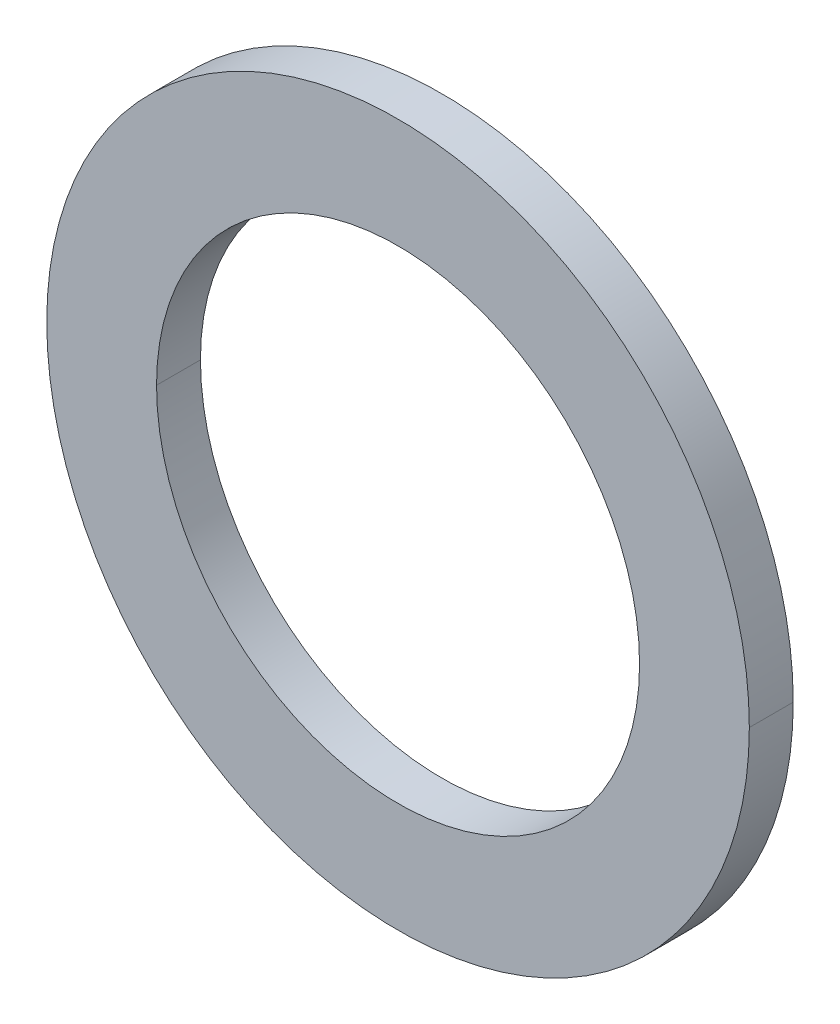
ISO-10303-21;
HEADER;
FILE_DESCRIPTION(('STEP AP214'),'2;1');
FILE_NAME('part.step','',(''),(''),'','','');
FILE_SCHEMA(('AUTOMOTIVE_DESIGN { 1 0 10303 214 1 1 1 1 }'));
ENDSEC;
DATA;
#1=APPLICATION_CONTEXT('core data for automotive mechanical design processes');
#2=APPLICATION_PROTOCOL_DEFINITION('international standard','automotive_design',2000,#1);
#3=PRODUCT_CONTEXT('',#1,'mechanical');
#4=PRODUCT('Part','Part','',(#3));
#5=PRODUCT_RELATED_PRODUCT_CATEGORY('part','',(#4));
#6=PRODUCT_DEFINITION_FORMATION('','',#4);
#7=PRODUCT_DEFINITION_CONTEXT('part definition',#1,'design');
#8=PRODUCT_DEFINITION('design','',#6,#7);
#9=PRODUCT_DEFINITION_SHAPE('','',#8);
#10=(LENGTH_UNIT() NAMED_UNIT(*) SI_UNIT(.MILLI.,.METRE.));
#11=(NAMED_UNIT(*) PLANE_ANGLE_UNIT() SI_UNIT($,.RADIAN.));
#12=(NAMED_UNIT(*) SI_UNIT($,.STERADIAN.) SOLID_ANGLE_UNIT());
#13=UNCERTAINTY_MEASURE_WITH_UNIT(LENGTH_MEASURE(1.E-05),#10,'distance_accuracy_value','');
#14=(GEOMETRIC_REPRESENTATION_CONTEXT(3) GLOBAL_UNCERTAINTY_ASSIGNED_CONTEXT((#13)) GLOBAL_UNIT_ASSIGNED_CONTEXT((#10,
#11,#12)) REPRESENTATION_CONTEXT('',''));
#15=CARTESIAN_POINT('',(0.,0.,0.));
#16=DIRECTION('',(0.,0.,1.));
#17=DIRECTION('',(1.,0.,0.));
#18=AXIS2_PLACEMENT_3D('',#15,#16,#17);
#19=CARTESIAN_POINT('',(0.,0.,1.));
#20=DIRECTION('',(0.,0.,-1.));
#21=DIRECTION('',(-1.,0.,0.));
#22=AXIS2_PLACEMENT_3D('',#19,#20,#21);
#23=CYLINDRICAL_SURFACE('',#22,5.5);
#24=CARTESIAN_POINT('',(0.,0.,1.));
#25=DIRECTION('',(0.,0.,1.));
#26=DIRECTION('',(1.,0.,0.));
#27=AXIS2_PLACEMENT_3D('',#24,#25,#26);
#28=CIRCLE('',#27,5.5);
#29=CARTESIAN_POINT('',(-5.5,0.,1.));
#30=VERTEX_POINT('',#29);
#31=CARTESIAN_POINT('',(5.5,0.,1.));
#32=VERTEX_POINT('',#31);
#33=EDGE_CURVE('E11',#30,#32,#28,.T.);
#34=ORIENTED_EDGE('',*,*,#33,.T.);
#35=DIRECTION('',(0.,0.,-1.));
#36=VECTOR('',#35,1.);
#37=CARTESIAN_POINT('',(5.5,0.,1.));
#38=LINE('',#37,#36);
#39=CARTESIAN_POINT('',(5.5,0.,0.));
#40=VERTEX_POINT('',#39);
#41=EDGE_CURVE('E28',#32,#40,#38,.T.);
#42=ORIENTED_EDGE('',*,*,#41,.T.);
#43=CARTESIAN_POINT('',(0.,0.,0.));
#44=DIRECTION('',(0.,0.,1.));
#45=DIRECTION('',(1.,0.,0.));
#46=AXIS2_PLACEMENT_3D('',#43,#44,#45);
#47=CIRCLE('',#46,5.5);
#48=CARTESIAN_POINT('',(-5.5,0.,0.));
#49=VERTEX_POINT('',#48);
#50=EDGE_CURVE('E82',#49,#40,#47,.T.);
#51=ORIENTED_EDGE('',*,*,#50,.F.);
#52=DIRECTION('',(0.,0.,-1.));
#53=VECTOR('',#52,1.);
#54=CARTESIAN_POINT('',(-5.5,0.,1.));
#55=LINE('',#54,#53);
#56=EDGE_CURVE('E107',#30,#49,#55,.T.);
#57=ORIENTED_EDGE('',*,*,#56,.F.);
#58=EDGE_LOOP('',(#34,#42,#51,#57));
#59=FACE_BOUND('',#58,.T.);
#60=ADVANCED_FACE('F17',(#59),#23,.F.);
#61=CARTESIAN_POINT('',(0.,0.,1.));
#62=DIRECTION('',(0.,0.,-1.));
#63=DIRECTION('',(-1.,0.,0.));
#64=AXIS2_PLACEMENT_3D('',#61,#62,#63);
#65=CYLINDRICAL_SURFACE('',#64,8.);
#66=CARTESIAN_POINT('',(0.,0.,1.));
#67=DIRECTION('',(0.,0.,1.));
#68=DIRECTION('',(1.,0.,0.));
#69=AXIS2_PLACEMENT_3D('',#66,#67,#68);
#70=CIRCLE('',#69,8.);
#71=CARTESIAN_POINT('',(8.,0.,1.));
#72=VERTEX_POINT('',#71);
#73=CARTESIAN_POINT('',(-8.,0.,1.));
#74=VERTEX_POINT('',#73);
#75=EDGE_CURVE('E70',#72,#74,#70,.T.);
#76=ORIENTED_EDGE('',*,*,#75,.F.);
#77=DIRECTION('',(0.,0.,-1.));
#78=VECTOR('',#77,1.);
#79=CARTESIAN_POINT('',(8.,0.,1.));
#80=LINE('',#79,#78);
#81=CARTESIAN_POINT('',(8.,0.,0.));
#82=VERTEX_POINT('',#81);
#83=EDGE_CURVE('E74',#72,#82,#80,.T.);
#84=ORIENTED_EDGE('',*,*,#83,.T.);
#85=CARTESIAN_POINT('',(0.,0.,0.));
#86=DIRECTION('',(0.,0.,1.));
#87=DIRECTION('',(1.,0.,0.));
#88=AXIS2_PLACEMENT_3D('',#85,#86,#87);
#89=CIRCLE('',#88,8.);
#90=CARTESIAN_POINT('',(-8.,0.,0.));
#91=VERTEX_POINT('',#90);
#92=EDGE_CURVE('E89',#82,#91,#89,.T.);
#93=ORIENTED_EDGE('',*,*,#92,.T.);
#94=DIRECTION('',(0.,0.,-1.));
#95=VECTOR('',#94,1.);
#96=CARTESIAN_POINT('',(-8.,0.,1.));
#97=LINE('',#96,#95);
#98=EDGE_CURVE('E21',#74,#91,#97,.T.);
#99=ORIENTED_EDGE('',*,*,#98,.F.);
#100=EDGE_LOOP('',(#76,#84,#93,#99));
#101=FACE_BOUND('',#100,.T.);
#102=ADVANCED_FACE('F72',(#101),#65,.T.);
#103=CARTESIAN_POINT('',(0.,0.,1.));
#104=DIRECTION('',(0.,0.,1.));
#105=DIRECTION('',(1.,0.,0.));
#106=AXIS2_PLACEMENT_3D('',#103,#104,#105);
#107=PLANE('',#106);
#108=CARTESIAN_POINT('',(0.,0.,1.));
#109=DIRECTION('',(0.,0.,1.));
#110=DIRECTION('',(1.,0.,0.));
#111=AXIS2_PLACEMENT_3D('',#108,#109,#110);
#112=CIRCLE('',#111,8.);
#113=EDGE_CURVE('E81',#74,#72,#112,.T.);
#114=ORIENTED_EDGE('',*,*,#113,.T.);
#115=ORIENTED_EDGE('',*,*,#75,.T.);
#116=EDGE_LOOP('',(#114,#115));
#117=FACE_BOUND('',#116,.T.);
#118=ORIENTED_EDGE('',*,*,#33,.F.);
#119=CARTESIAN_POINT('',(0.,0.,1.));
#120=DIRECTION('',(0.,0.,1.));
#121=DIRECTION('',(1.,0.,0.));
#122=AXIS2_PLACEMENT_3D('',#119,#120,#121);
#123=CIRCLE('',#122,5.5);
#124=EDGE_CURVE('E104',#32,#30,#123,.T.);
#125=ORIENTED_EDGE('',*,*,#124,.F.);
#126=EDGE_LOOP('',(#118,#125));
#127=FACE_BOUND('',#126,.T.);
#128=ADVANCED_FACE('F91',(#117,#127),#107,.T.);
#129=CARTESIAN_POINT('',(0.,0.,0.));
#130=DIRECTION('',(0.,0.,1.));
#131=DIRECTION('',(1.,0.,0.));
#132=AXIS2_PLACEMENT_3D('',#129,#130,#131);
#133=PLANE('',#132);
#134=CARTESIAN_POINT('',(0.,0.,0.));
#135=DIRECTION('',(0.,0.,1.));
#136=DIRECTION('',(1.,0.,0.));
#137=AXIS2_PLACEMENT_3D('',#134,#135,#136);
#138=CIRCLE('',#137,8.);
#139=EDGE_CURVE('E87',#91,#82,#138,.T.);
#140=ORIENTED_EDGE('',*,*,#139,.F.);
#141=ORIENTED_EDGE('',*,*,#92,.F.);
#142=EDGE_LOOP('',(#140,#141));
#143=FACE_BOUND('',#142,.T.);
#144=ORIENTED_EDGE('',*,*,#50,.T.);
#145=CARTESIAN_POINT('',(0.,0.,0.));
#146=DIRECTION('',(0.,0.,1.));
#147=DIRECTION('',(1.,0.,0.));
#148=AXIS2_PLACEMENT_3D('',#145,#146,#147);
#149=CIRCLE('',#148,5.5);
#150=EDGE_CURVE('E100',#40,#49,#149,.T.);
#151=ORIENTED_EDGE('',*,*,#150,.T.);
#152=EDGE_LOOP('',(#144,#151));
#153=FACE_BOUND('',#152,.T.);
#154=ADVANCED_FACE('F122',(#143,#153),#133,.F.);
#155=CARTESIAN_POINT('',(0.,0.,1.));
#156=DIRECTION('',(0.,0.,-1.));
#157=DIRECTION('',(-1.,0.,0.));
#158=AXIS2_PLACEMENT_3D('',#155,#156,#157);
#159=CYLINDRICAL_SURFACE('',#158,8.);
#160=ORIENTED_EDGE('',*,*,#83,.F.);
#161=ORIENTED_EDGE('',*,*,#113,.F.);
#162=ORIENTED_EDGE('',*,*,#98,.T.);
#163=ORIENTED_EDGE('',*,*,#139,.T.);
#164=EDGE_LOOP('',(#160,#161,#162,#163));
#165=FACE_BOUND('',#164,.T.);
#166=ADVANCED_FACE('F85',(#165),#159,.T.);
#167=CARTESIAN_POINT('',(0.,0.,1.));
#168=DIRECTION('',(0.,0.,-1.));
#169=DIRECTION('',(-1.,0.,0.));
#170=AXIS2_PLACEMENT_3D('',#167,#168,#169);
#171=CYLINDRICAL_SURFACE('',#170,5.5);
#172=ORIENTED_EDGE('',*,*,#41,.F.);
#173=ORIENTED_EDGE('',*,*,#124,.T.);
#174=ORIENTED_EDGE('',*,*,#56,.T.);
#175=ORIENTED_EDGE('',*,*,#150,.F.);
#176=EDGE_LOOP('',(#172,#173,#174,#175));
#177=FACE_BOUND('',#176,.T.);
#178=ADVANCED_FACE('F19',(#177),#171,.F.);
#179=CLOSED_SHELL('',(#60,#102,#128,#154,#166,#178));
#180=MANIFOLD_SOLID_BREP('B1',#179);
#181=ADVANCED_BREP_SHAPE_REPRESENTATION('',(#18,#180),#14);
#182=SHAPE_DEFINITION_REPRESENTATION(#9,#181);
ENDSEC;
END-ISO-10303-21;
